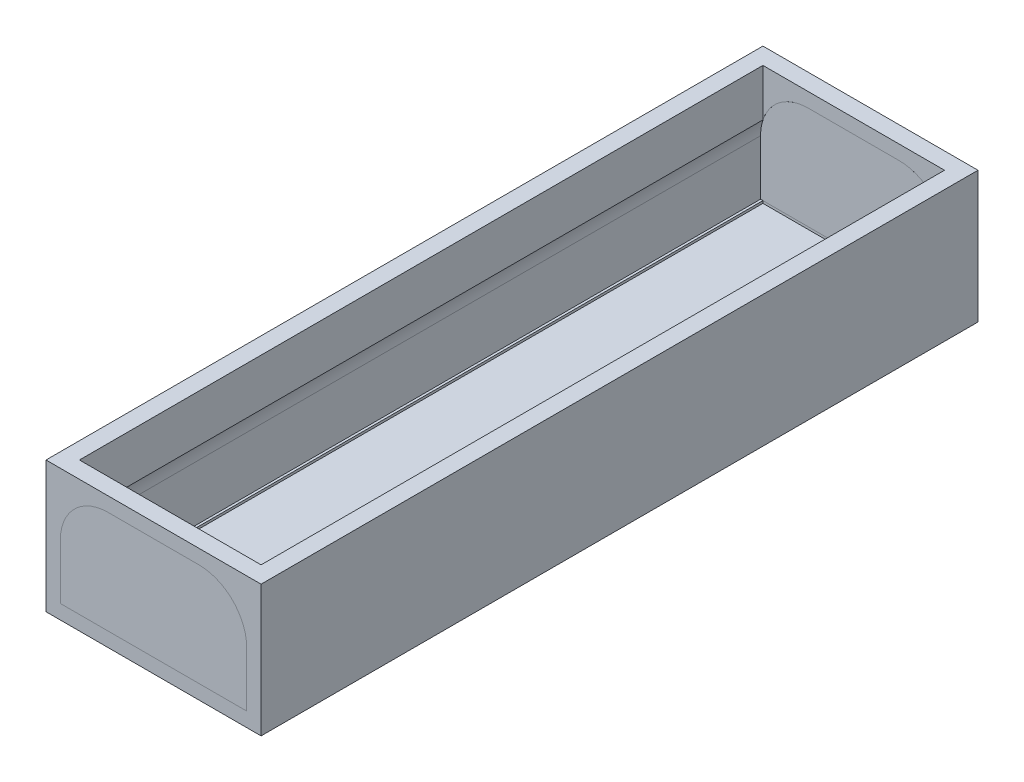
ISO-10303-21;
HEADER;
FILE_DESCRIPTION(('STEP AP214'),'2;1');
FILE_NAME('part.step','',(''),(''),'','','');
FILE_SCHEMA(('AUTOMOTIVE_DESIGN { 1 0 10303 214 1 1 1 1 }'));
ENDSEC;
DATA;
#1=APPLICATION_CONTEXT('core data for automotive mechanical design processes');
#2=APPLICATION_PROTOCOL_DEFINITION('international standard','automotive_design',2000,#1);
#3=PRODUCT_CONTEXT('',#1,'mechanical');
#4=PRODUCT('Part','Part','',(#3));
#5=PRODUCT_RELATED_PRODUCT_CATEGORY('part','',(#4));
#6=PRODUCT_DEFINITION_FORMATION('','',#4);
#7=PRODUCT_DEFINITION_CONTEXT('part definition',#1,'design');
#8=PRODUCT_DEFINITION('design','',#6,#7);
#9=PRODUCT_DEFINITION_SHAPE('','',#8);
#10=(LENGTH_UNIT() NAMED_UNIT(*) SI_UNIT(.MILLI.,.METRE.));
#11=(NAMED_UNIT(*) PLANE_ANGLE_UNIT() SI_UNIT($,.RADIAN.));
#12=(NAMED_UNIT(*) SI_UNIT($,.STERADIAN.) SOLID_ANGLE_UNIT());
#13=UNCERTAINTY_MEASURE_WITH_UNIT(LENGTH_MEASURE(1.E-05),#10,'distance_accuracy_value','');
#14=(GEOMETRIC_REPRESENTATION_CONTEXT(3) GLOBAL_UNCERTAINTY_ASSIGNED_CONTEXT((#13)) GLOBAL_UNIT_ASSIGNED_CONTEXT((#10,
#11,#12)) REPRESENTATION_CONTEXT('',''));
#15=CARTESIAN_POINT('',(0.,0.,0.));
#16=DIRECTION('',(0.,0.,1.));
#17=DIRECTION('',(1.,0.,0.));
#18=AXIS2_PLACEMENT_3D('',#15,#16,#17);
#19=CARTESIAN_POINT('',(-19.,1.49999999999999,7.00000000000006));
#20=DIRECTION('',(0.,0.,-1.));
#21=DIRECTION('',(1.,0.,0.));
#22=AXIS2_PLACEMENT_3D('',#19,#20,#21);
#23=CYLINDRICAL_SURFACE('',#22,20.);
#24=CARTESIAN_POINT('',(-19.,1.49999999999999,2.00000000000006));
#25=DIRECTION('',(0.,0.,1.));
#26=DIRECTION('',(1.,0.,0.));
#27=AXIS2_PLACEMENT_3D('',#24,#25,#26);
#28=CIRCLE('',#27,20.);
#29=CARTESIAN_POINT('',(-18.9999999999999,21.5,2.00000000000006));
#30=VERTEX_POINT('',#29);
#31=CARTESIAN_POINT('',(-39.,1.49999999999985,2.00000000000006));
#32=VERTEX_POINT('',#31);
#33=EDGE_CURVE('E140',#30,#32,#28,.T.);
#34=ORIENTED_EDGE('',*,*,#33,.T.);
#35=DIRECTION('',(0.,0.,-1.));
#36=VECTOR('',#35,1.);
#37=CARTESIAN_POINT('',(-39.,1.49999999999985,7.00000000000006));
#38=LINE('',#37,#36);
#39=CARTESIAN_POINT('',(-39.,1.49999999999985,7.00000000000006));
#40=VERTEX_POINT('',#39);
#41=EDGE_CURVE('E59',#40,#32,#38,.T.);
#42=ORIENTED_EDGE('',*,*,#41,.F.);
#43=CARTESIAN_POINT('',(-19.,1.49999999999999,7.00000000000006));
#44=DIRECTION('',(0.,0.,1.));
#45=DIRECTION('',(1.,0.,0.));
#46=AXIS2_PLACEMENT_3D('',#43,#44,#45);
#47=CIRCLE('',#46,20.);
#48=CARTESIAN_POINT('',(-18.9999999999999,21.5,7.00000000000006));
#49=VERTEX_POINT('',#48);
#50=EDGE_CURVE('E149',#49,#40,#47,.T.);
#51=ORIENTED_EDGE('',*,*,#50,.F.);
#52=DIRECTION('',(0.,0.,-1.));
#53=VECTOR('',#52,1.);
#54=CARTESIAN_POINT('',(-18.9999999999999,21.5,7.00000000000006));
#55=LINE('',#54,#53);
#56=EDGE_CURVE('E12',#49,#30,#55,.T.);
#57=ORIENTED_EDGE('',*,*,#56,.T.);
#58=EDGE_LOOP('',(#34,#42,#51,#57));
#59=FACE_BOUND('',#58,.T.);
#60=ADVANCED_FACE('F56',(#59),#23,.T.);
#61=CARTESIAN_POINT('',(18.9999999999999,21.5,7.00000000000006));
#62=DIRECTION('',(0.,1.,0.));
#63=DIRECTION('',(-1.,0.,0.));
#64=AXIS2_PLACEMENT_3D('',#61,#62,#63);
#65=PLANE('',#64);
#66=DIRECTION('',(-1.,0.,0.));
#67=VECTOR('',#66,1.);
#68=CARTESIAN_POINT('',(18.9999999999999,21.5,2.00000000000006));
#69=LINE('',#68,#67);
#70=CARTESIAN_POINT('',(18.9999999999999,21.5,2.00000000000006));
#71=VERTEX_POINT('',#70);
#72=EDGE_CURVE('E103',#71,#30,#69,.T.);
#73=ORIENTED_EDGE('',*,*,#72,.T.);
#74=ORIENTED_EDGE('',*,*,#56,.F.);
#75=DIRECTION('',(-1.,0.,0.));
#76=VECTOR('',#75,1.);
#77=CARTESIAN_POINT('',(18.9999999999999,21.5,7.00000000000006));
#78=LINE('',#77,#76);
#79=CARTESIAN_POINT('',(18.9999999999999,21.5,7.00000000000006));
#80=VERTEX_POINT('',#79);
#81=EDGE_CURVE('E74',#80,#49,#78,.T.);
#82=ORIENTED_EDGE('',*,*,#81,.F.);
#83=DIRECTION('',(0.,0.,-1.));
#84=VECTOR('',#83,1.);
#85=CARTESIAN_POINT('',(18.9999999999999,21.5,7.00000000000006));
#86=LINE('',#85,#84);
#87=EDGE_CURVE('E65',#80,#71,#86,.T.);
#88=ORIENTED_EDGE('',*,*,#87,.T.);
#89=EDGE_LOOP('',(#73,#74,#82,#88));
#90=FACE_BOUND('',#89,.T.);
#91=ADVANCED_FACE('F174',(#90),#65,.T.);
#92=CARTESIAN_POINT('',(19.,1.5,7.00000000000006));
#93=DIRECTION('',(0.,0.,-1.));
#94=DIRECTION('',(1.,0.,0.));
#95=AXIS2_PLACEMENT_3D('',#92,#93,#94);
#96=CYLINDRICAL_SURFACE('',#95,20.);
#97=CARTESIAN_POINT('',(19.,1.5,2.00000000000006));
#98=DIRECTION('',(0.,0.,1.));
#99=DIRECTION('',(1.,0.,0.));
#100=AXIS2_PLACEMENT_3D('',#97,#98,#99);
#101=CIRCLE('',#100,20.);
#102=CARTESIAN_POINT('',(39.,1.49999999999986,2.00000000000006));
#103=VERTEX_POINT('',#102);
#104=EDGE_CURVE('E97',#103,#71,#101,.T.);
#105=ORIENTED_EDGE('',*,*,#104,.T.);
#106=ORIENTED_EDGE('',*,*,#87,.F.);
#107=CARTESIAN_POINT('',(19.,1.5,7.00000000000006));
#108=DIRECTION('',(0.,0.,1.));
#109=DIRECTION('',(1.,0.,0.));
#110=AXIS2_PLACEMENT_3D('',#107,#108,#109);
#111=CIRCLE('',#110,20.);
#112=CARTESIAN_POINT('',(39.,1.49999999999986,7.00000000000006));
#113=VERTEX_POINT('',#112);
#114=EDGE_CURVE('E122',#113,#80,#111,.T.);
#115=ORIENTED_EDGE('',*,*,#114,.F.);
#116=DIRECTION('',(0.,0.,-1.));
#117=VECTOR('',#116,1.);
#118=CARTESIAN_POINT('',(39.,1.49999999999986,7.00000000000006));
#119=LINE('',#118,#117);
#120=EDGE_CURVE('E129',#113,#103,#119,.T.);
#121=ORIENTED_EDGE('',*,*,#120,.T.);
#122=EDGE_LOOP('',(#105,#106,#115,#121));
#123=FACE_BOUND('',#122,.T.);
#124=ADVANCED_FACE('F135',(#123),#96,.T.);
#125=CARTESIAN_POINT('',(39.,-21.5,7.00000000000006));
#126=DIRECTION('',(1.,0.,0.));
#127=DIRECTION('',(0.,1.,0.));
#128=AXIS2_PLACEMENT_3D('',#125,#126,#127);
#129=PLANE('',#128);
#130=DIRECTION('',(0.,1.,0.));
#131=VECTOR('',#130,1.);
#132=CARTESIAN_POINT('',(39.,-21.5,2.00000000000006));
#133=LINE('',#132,#131);
#134=CARTESIAN_POINT('',(39.,-21.5,2.00000000000006));
#135=VERTEX_POINT('',#134);
#136=EDGE_CURVE('E132',#135,#103,#133,.T.);
#137=ORIENTED_EDGE('',*,*,#136,.T.);
#138=ORIENTED_EDGE('',*,*,#120,.F.);
#139=DIRECTION('',(0.,1.,0.));
#140=VECTOR('',#139,1.);
#141=CARTESIAN_POINT('',(39.,-21.5,7.00000000000006));
#142=LINE('',#141,#140);
#143=CARTESIAN_POINT('',(39.,-21.5,7.00000000000006));
#144=VERTEX_POINT('',#143);
#145=EDGE_CURVE('E118',#144,#113,#142,.T.);
#146=ORIENTED_EDGE('',*,*,#145,.F.);
#147=DIRECTION('',(0.,0.,-1.));
#148=VECTOR('',#147,1.);
#149=CARTESIAN_POINT('',(39.,-21.5,7.00000000000006));
#150=LINE('',#149,#148);
#151=EDGE_CURVE('E133',#144,#135,#150,.T.);
#152=ORIENTED_EDGE('',*,*,#151,.T.);
#153=EDGE_LOOP('',(#137,#138,#146,#152));
#154=FACE_BOUND('',#153,.T.);
#155=ADVANCED_FACE('F130',(#154),#129,.T.);
#156=CARTESIAN_POINT('',(-39.,-21.5,7.00000000000006));
#157=DIRECTION('',(0.,-1.,0.));
#158=DIRECTION('',(1.,0.,0.));
#159=AXIS2_PLACEMENT_3D('',#156,#157,#158);
#160=PLANE('',#159);
#161=DIRECTION('',(1.,0.,0.));
#162=VECTOR('',#161,1.);
#163=CARTESIAN_POINT('',(-39.,-21.5,2.00000000000006));
#164=LINE('',#163,#162);
#165=CARTESIAN_POINT('',(-39.,-21.5,2.00000000000006));
#166=VERTEX_POINT('',#165);
#167=EDGE_CURVE('E145',#166,#135,#164,.T.);
#168=ORIENTED_EDGE('',*,*,#167,.T.);
#169=ORIENTED_EDGE('',*,*,#151,.F.);
#170=DIRECTION('',(1.,0.,0.));
#171=VECTOR('',#170,1.);
#172=CARTESIAN_POINT('',(-39.,-21.5,7.00000000000006));
#173=LINE('',#172,#171);
#174=CARTESIAN_POINT('',(-39.,-21.5,7.00000000000006));
#175=VERTEX_POINT('',#174);
#176=EDGE_CURVE('E124',#175,#144,#173,.T.);
#177=ORIENTED_EDGE('',*,*,#176,.F.);
#178=DIRECTION('',(0.,0.,-1.));
#179=VECTOR('',#178,1.);
#180=CARTESIAN_POINT('',(-39.,-21.5,7.00000000000006));
#181=LINE('',#180,#179);
#182=EDGE_CURVE('E152',#175,#166,#181,.T.);
#183=ORIENTED_EDGE('',*,*,#182,.T.);
#184=EDGE_LOOP('',(#168,#169,#177,#183));
#185=FACE_BOUND('',#184,.T.);
#186=ADVANCED_FACE('F163',(#185),#160,.T.);
#187=CARTESIAN_POINT('',(-39.,1.49999999999985,7.00000000000006));
#188=DIRECTION('',(-1.,0.,0.));
#189=DIRECTION('',(0.,0.,-1.));
#190=AXIS2_PLACEMENT_3D('',#187,#188,#189);
#191=PLANE('',#190);
#192=DIRECTION('',(0.,-1.,0.));
#193=VECTOR('',#192,1.);
#194=CARTESIAN_POINT('',(-39.,1.49999999999985,2.00000000000006));
#195=LINE('',#194,#193);
#196=EDGE_CURVE('E143',#32,#166,#195,.T.);
#197=ORIENTED_EDGE('',*,*,#196,.T.);
#198=ORIENTED_EDGE('',*,*,#182,.F.);
#199=DIRECTION('',(0.,-1.,0.));
#200=VECTOR('',#199,1.);
#201=CARTESIAN_POINT('',(-39.,1.49999999999985,7.00000000000006));
#202=LINE('',#201,#200);
#203=EDGE_CURVE('E111',#40,#175,#202,.T.);
#204=ORIENTED_EDGE('',*,*,#203,.F.);
#205=ORIENTED_EDGE('',*,*,#41,.T.);
#206=EDGE_LOOP('',(#197,#198,#204,#205));
#207=FACE_BOUND('',#206,.T.);
#208=ADVANCED_FACE('F157',(#207),#191,.T.);
#209=CARTESIAN_POINT('',(-19.,1.49999999999999,7.00000000000006));
#210=DIRECTION('',(0.,0.,-1.));
#211=DIRECTION('',(1.,0.,0.));
#212=AXIS2_PLACEMENT_3D('',#209,#210,#211);
#213=PLANE('',#212);
#214=ORIENTED_EDGE('',*,*,#50,.T.);
#215=ORIENTED_EDGE('',*,*,#203,.T.);
#216=ORIENTED_EDGE('',*,*,#176,.T.);
#217=ORIENTED_EDGE('',*,*,#145,.T.);
#218=ORIENTED_EDGE('',*,*,#114,.T.);
#219=ORIENTED_EDGE('',*,*,#81,.T.);
#220=EDGE_LOOP('',(#214,#215,#216,#217,#218,#219));
#221=FACE_BOUND('',#220,.T.);
#222=ADVANCED_FACE('F120',(#221),#213,.F.);
#223=CARTESIAN_POINT('',(-19.,1.49999999999999,2.00000000000006));
#224=DIRECTION('',(0.,0.,-1.));
#225=DIRECTION('',(1.,0.,0.));
#226=AXIS2_PLACEMENT_3D('',#223,#224,#225);
#227=PLANE('',#226);
#228=ORIENTED_EDGE('',*,*,#33,.F.);
#229=ORIENTED_EDGE('',*,*,#72,.F.);
#230=ORIENTED_EDGE('',*,*,#104,.F.);
#231=ORIENTED_EDGE('',*,*,#136,.F.);
#232=ORIENTED_EDGE('',*,*,#167,.F.);
#233=ORIENTED_EDGE('',*,*,#196,.F.);
#234=EDGE_LOOP('',(#228,#229,#230,#231,#232,#233));
#235=FACE_BOUND('',#234,.T.);
#236=ADVANCED_FACE('F162',(#235),#227,.T.);
#237=CLOSED_SHELL('',(#60,#91,#124,#155,#186,#208,#222,#236));
#238=MANIFOLD_SOLID_BREP('B2',#237);
#239=CARTESIAN_POINT('',(-19.,1.49999999999999,295.));
#240=DIRECTION('',(0.,0.,1.));
#241=DIRECTION('',(1.,0.,0.));
#242=AXIS2_PLACEMENT_3D('',#239,#240,#241);
#243=CYLINDRICAL_SURFACE('',#242,20.);
#244=CARTESIAN_POINT('',(-19.,1.49999999999999,300.));
#245=DIRECTION('',(0.,0.,1.));
#246=DIRECTION('',(1.,0.,0.));
#247=AXIS2_PLACEMENT_3D('',#244,#245,#246);
#248=CIRCLE('',#247,20.);
#249=CARTESIAN_POINT('',(-18.9999999999999,21.5,300.));
#250=VERTEX_POINT('',#249);
#251=CARTESIAN_POINT('',(-39.,1.49999999999985,300.));
#252=VERTEX_POINT('',#251);
#253=EDGE_CURVE('E373',#250,#252,#248,.T.);
#254=ORIENTED_EDGE('',*,*,#253,.F.);
#255=DIRECTION('',(0.,0.,1.));
#256=VECTOR('',#255,1.);
#257=CARTESIAN_POINT('',(-18.9999999999999,21.5,295.));
#258=LINE('',#257,#256);
#259=CARTESIAN_POINT('',(-18.9999999999999,21.5,295.));
#260=VERTEX_POINT('',#259);
#261=EDGE_CURVE('E54',#260,#250,#258,.T.);
#262=ORIENTED_EDGE('',*,*,#261,.F.);
#263=CARTESIAN_POINT('',(-19.,1.49999999999999,295.));
#264=DIRECTION('',(0.,0.,1.));
#265=DIRECTION('',(1.,0.,0.));
#266=AXIS2_PLACEMENT_3D('',#263,#264,#265);
#267=CIRCLE('',#266,20.);
#268=CARTESIAN_POINT('',(-39.,1.49999999999985,295.));
#269=VERTEX_POINT('',#268);
#270=EDGE_CURVE('E387',#260,#269,#267,.T.);
#271=ORIENTED_EDGE('',*,*,#270,.T.);
#272=DIRECTION('',(0.,0.,1.));
#273=VECTOR('',#272,1.);
#274=CARTESIAN_POINT('',(-39.,1.49999999999985,295.));
#275=LINE('',#274,#273);
#276=EDGE_CURVE('E291',#269,#252,#275,.T.);
#277=ORIENTED_EDGE('',*,*,#276,.T.);
#278=EDGE_LOOP('',(#254,#262,#271,#277));
#279=FACE_BOUND('',#278,.T.);
#280=ADVANCED_FACE('F288',(#279),#243,.T.);
#281=CARTESIAN_POINT('',(18.9999999999999,21.5,295.));
#282=DIRECTION('',(0.,1.,0.));
#283=DIRECTION('',(-1.,0.,0.));
#284=AXIS2_PLACEMENT_3D('',#281,#282,#283);
#285=PLANE('',#284);
#286=DIRECTION('',(-1.,0.,0.));
#287=VECTOR('',#286,1.);
#288=CARTESIAN_POINT('',(18.9999999999999,21.5,300.));
#289=LINE('',#288,#287);
#290=CARTESIAN_POINT('',(18.9999999999999,21.5,300.));
#291=VERTEX_POINT('',#290);
#292=EDGE_CURVE('E385',#291,#250,#289,.T.);
#293=ORIENTED_EDGE('',*,*,#292,.F.);
#294=DIRECTION('',(0.,0.,1.));
#295=VECTOR('',#294,1.);
#296=CARTESIAN_POINT('',(18.9999999999999,21.5,295.));
#297=LINE('',#296,#295);
#298=CARTESIAN_POINT('',(18.9999999999999,21.5,295.));
#299=VERTEX_POINT('',#298);
#300=EDGE_CURVE('E297',#299,#291,#297,.T.);
#301=ORIENTED_EDGE('',*,*,#300,.F.);
#302=DIRECTION('',(-1.,0.,0.));
#303=VECTOR('',#302,1.);
#304=CARTESIAN_POINT('',(18.9999999999999,21.5,295.));
#305=LINE('',#304,#303);
#306=EDGE_CURVE('E363',#299,#260,#305,.T.);
#307=ORIENTED_EDGE('',*,*,#306,.T.);
#308=ORIENTED_EDGE('',*,*,#261,.T.);
#309=EDGE_LOOP('',(#293,#301,#307,#308));
#310=FACE_BOUND('',#309,.T.);
#311=ADVANCED_FACE('F395',(#310),#285,.T.);
#312=CARTESIAN_POINT('',(19.,1.5,295.));
#313=DIRECTION('',(0.,0.,1.));
#314=DIRECTION('',(1.,0.,0.));
#315=AXIS2_PLACEMENT_3D('',#312,#313,#314);
#316=CYLINDRICAL_SURFACE('',#315,20.);
#317=CARTESIAN_POINT('',(19.,1.5,300.));
#318=DIRECTION('',(0.,0.,1.));
#319=DIRECTION('',(1.,0.,0.));
#320=AXIS2_PLACEMENT_3D('',#317,#318,#319);
#321=CIRCLE('',#320,20.);
#322=CARTESIAN_POINT('',(39.,1.49999999999986,300.));
#323=VERTEX_POINT('',#322);
#324=EDGE_CURVE('E350',#323,#291,#321,.T.);
#325=ORIENTED_EDGE('',*,*,#324,.F.);
#326=DIRECTION('',(0.,0.,1.));
#327=VECTOR('',#326,1.);
#328=CARTESIAN_POINT('',(39.,1.49999999999986,295.));
#329=LINE('',#328,#327);
#330=CARTESIAN_POINT('',(39.,1.49999999999986,295.));
#331=VERTEX_POINT('',#330);
#332=EDGE_CURVE('E345',#331,#323,#329,.T.);
#333=ORIENTED_EDGE('',*,*,#332,.F.);
#334=CARTESIAN_POINT('',(19.,1.5,295.));
#335=DIRECTION('',(0.,0.,1.));
#336=DIRECTION('',(1.,0.,0.));
#337=AXIS2_PLACEMENT_3D('',#334,#335,#336);
#338=CIRCLE('',#337,20.);
#339=EDGE_CURVE('E348',#331,#299,#338,.T.);
#340=ORIENTED_EDGE('',*,*,#339,.T.);
#341=ORIENTED_EDGE('',*,*,#300,.T.);
#342=EDGE_LOOP('',(#325,#333,#340,#341));
#343=FACE_BOUND('',#342,.T.);
#344=ADVANCED_FACE('F347',(#343),#316,.T.);
#345=CARTESIAN_POINT('',(39.,-21.5,295.));
#346=DIRECTION('',(1.,0.,0.));
#347=DIRECTION('',(0.,1.,0.));
#348=AXIS2_PLACEMENT_3D('',#345,#346,#347);
#349=PLANE('',#348);
#350=DIRECTION('',(0.,1.,0.));
#351=VECTOR('',#350,1.);
#352=CARTESIAN_POINT('',(39.,-21.5,300.));
#353=LINE('',#352,#351);
#354=CARTESIAN_POINT('',(39.,-21.5,300.));
#355=VERTEX_POINT('',#354);
#356=EDGE_CURVE('E382',#355,#323,#353,.T.);
#357=ORIENTED_EDGE('',*,*,#356,.F.);
#358=DIRECTION('',(0.,0.,1.));
#359=VECTOR('',#358,1.);
#360=CARTESIAN_POINT('',(39.,-21.5,295.));
#361=LINE('',#360,#359);
#362=CARTESIAN_POINT('',(39.,-21.5,295.));
#363=VERTEX_POINT('',#362);
#364=EDGE_CURVE('E355',#363,#355,#361,.T.);
#365=ORIENTED_EDGE('',*,*,#364,.F.);
#366=DIRECTION('',(0.,1.,0.));
#367=VECTOR('',#366,1.);
#368=CARTESIAN_POINT('',(39.,-21.5,295.));
#369=LINE('',#368,#367);
#370=EDGE_CURVE('E361',#363,#331,#369,.T.);
#371=ORIENTED_EDGE('',*,*,#370,.T.);
#372=ORIENTED_EDGE('',*,*,#332,.T.);
#373=EDGE_LOOP('',(#357,#365,#371,#372));
#374=FACE_BOUND('',#373,.T.);
#375=ADVANCED_FACE('F365',(#374),#349,.T.);
#376=CARTESIAN_POINT('',(-39.,-21.5,295.));
#377=DIRECTION('',(0.,-1.,0.));
#378=DIRECTION('',(1.,0.,0.));
#379=AXIS2_PLACEMENT_3D('',#376,#377,#378);
#380=PLANE('',#379);
#381=DIRECTION('',(1.,0.,0.));
#382=VECTOR('',#381,1.);
#383=CARTESIAN_POINT('',(-39.,-21.5,300.));
#384=LINE('',#383,#382);
#385=CARTESIAN_POINT('',(-39.,-21.5,300.));
#386=VERTEX_POINT('',#385);
#387=EDGE_CURVE('E379',#386,#355,#384,.T.);
#388=ORIENTED_EDGE('',*,*,#387,.F.);
#389=DIRECTION('',(0.,0.,1.));
#390=VECTOR('',#389,1.);
#391=CARTESIAN_POINT('',(-39.,-21.5,295.));
#392=LINE('',#391,#390);
#393=CARTESIAN_POINT('',(-39.,-21.5,295.));
#394=VERTEX_POINT('',#393);
#395=EDGE_CURVE('E390',#394,#386,#392,.T.);
#396=ORIENTED_EDGE('',*,*,#395,.F.);
#397=DIRECTION('',(1.,0.,0.));
#398=VECTOR('',#397,1.);
#399=CARTESIAN_POINT('',(-39.,-21.5,295.));
#400=LINE('',#399,#398);
#401=EDGE_CURVE('E366',#394,#363,#400,.T.);
#402=ORIENTED_EDGE('',*,*,#401,.T.);
#403=ORIENTED_EDGE('',*,*,#364,.T.);
#404=EDGE_LOOP('',(#388,#396,#402,#403));
#405=FACE_BOUND('',#404,.T.);
#406=ADVANCED_FACE('F408',(#405),#380,.T.);
#407=CARTESIAN_POINT('',(-39.,1.49999999999985,295.));
#408=DIRECTION('',(-1.,0.,0.));
#409=DIRECTION('',(0.,0.,1.));
#410=AXIS2_PLACEMENT_3D('',#407,#408,#409);
#411=PLANE('',#410);
#412=DIRECTION('',(0.,-1.,0.));
#413=VECTOR('',#412,1.);
#414=CARTESIAN_POINT('',(-39.,1.49999999999985,300.));
#415=LINE('',#414,#413);
#416=EDGE_CURVE('E376',#252,#386,#415,.T.);
#417=ORIENTED_EDGE('',*,*,#416,.F.);
#418=ORIENTED_EDGE('',*,*,#276,.F.);
#419=DIRECTION('',(0.,-1.,0.));
#420=VECTOR('',#419,1.);
#421=CARTESIAN_POINT('',(-39.,1.49999999999985,295.));
#422=LINE('',#421,#420);
#423=EDGE_CURVE('E368',#269,#394,#422,.T.);
#424=ORIENTED_EDGE('',*,*,#423,.T.);
#425=ORIENTED_EDGE('',*,*,#395,.T.);
#426=EDGE_LOOP('',(#417,#418,#424,#425));
#427=FACE_BOUND('',#426,.T.);
#428=ADVANCED_FACE('F392',(#427),#411,.T.);
#429=CARTESIAN_POINT('',(-19.,1.49999999999999,295.));
#430=DIRECTION('',(0.,0.,1.));
#431=DIRECTION('',(1.,0.,0.));
#432=AXIS2_PLACEMENT_3D('',#429,#430,#431);
#433=PLANE('',#432);
#434=ORIENTED_EDGE('',*,*,#270,.F.);
#435=ORIENTED_EDGE('',*,*,#306,.F.);
#436=ORIENTED_EDGE('',*,*,#339,.F.);
#437=ORIENTED_EDGE('',*,*,#370,.F.);
#438=ORIENTED_EDGE('',*,*,#401,.F.);
#439=ORIENTED_EDGE('',*,*,#423,.F.);
#440=EDGE_LOOP('',(#434,#435,#436,#437,#438,#439));
#441=FACE_BOUND('',#440,.T.);
#442=ADVANCED_FACE('F359',(#441),#433,.F.);
#443=CARTESIAN_POINT('',(-19.,1.49999999999999,300.));
#444=DIRECTION('',(0.,0.,1.));
#445=DIRECTION('',(1.,0.,0.));
#446=AXIS2_PLACEMENT_3D('',#443,#444,#445);
#447=PLANE('',#446);
#448=ORIENTED_EDGE('',*,*,#253,.T.);
#449=ORIENTED_EDGE('',*,*,#416,.T.);
#450=ORIENTED_EDGE('',*,*,#387,.T.);
#451=ORIENTED_EDGE('',*,*,#356,.T.);
#452=ORIENTED_EDGE('',*,*,#324,.T.);
#453=ORIENTED_EDGE('',*,*,#292,.T.);
#454=EDGE_LOOP('',(#448,#449,#450,#451,#452,#453));
#455=FACE_BOUND('',#454,.T.);
#456=ADVANCED_FACE('F394',(#455),#447,.T.);
#457=CLOSED_SHELL('',(#280,#311,#344,#375,#406,#428,#442,#456));
#458=MANIFOLD_SOLID_BREP('B6',#457);
#459=CARTESIAN_POINT('',(38.,-22.4999999999999,293.));
#460=DIRECTION('',(1.,0.,0.));
#461=DIRECTION('',(0.,1.,0.));
#462=AXIS2_PLACEMENT_3D('',#459,#460,#461);
#463=PLANE('',#462);
#464=DIRECTION('',(0.,1.,0.));
#465=VECTOR('',#464,1.);
#466=CARTESIAN_POINT('',(38.,-22.4999999999999,7.));
#467=LINE('',#466,#465);
#468=CARTESIAN_POINT('',(38.,7.74499799839839,7.00000000000001));
#469=VERTEX_POINT('',#468);
#470=CARTESIAN_POINT('',(38.,27.5,7.00000000000001));
#471=VERTEX_POINT('',#470);
#472=EDGE_CURVE('E725',#469,#471,#467,.T.);
#473=ORIENTED_EDGE('',*,*,#472,.F.);
#474=DIRECTION('',(0.,0.,1.));
#475=VECTOR('',#474,1.);
#476=CARTESIAN_POINT('',(38.,7.7449979983984,-175.));
#477=LINE('',#476,#475);
#478=CARTESIAN_POINT('',(38.,7.7449979983984,293.));
#479=VERTEX_POINT('',#478);
#480=EDGE_CURVE('E702',#469,#479,#477,.T.);
#481=ORIENTED_EDGE('',*,*,#480,.T.);
#482=DIRECTION('',(0.,1.,0.));
#483=VECTOR('',#482,1.);
#484=CARTESIAN_POINT('',(38.,-22.4999999999999,293.));
#485=LINE('',#484,#483);
#486=CARTESIAN_POINT('',(38.,27.5,293.));
#487=VERTEX_POINT('',#486);
#488=EDGE_CURVE('E740',#479,#487,#485,.T.);
#489=ORIENTED_EDGE('',*,*,#488,.T.);
#490=DIRECTION('',(0.,0.,-1.));
#491=VECTOR('',#490,1.);
#492=CARTESIAN_POINT('',(38.,27.5,293.));
#493=LINE('',#492,#491);
#494=EDGE_CURVE('E711',#487,#471,#493,.T.);
#495=ORIENTED_EDGE('',*,*,#494,.T.);
#496=EDGE_LOOP('',(#473,#481,#489,#495));
#497=FACE_BOUND('',#496,.T.);
#498=ADVANCED_FACE('F497',(#497),#463,.F.);
#499=CARTESIAN_POINT('',(-45.,-27.5,300.));
#500=DIRECTION('',(1.,0.,0.));
#501=DIRECTION('',(0.,0.,-1.));
#502=AXIS2_PLACEMENT_3D('',#499,#500,#501);
#503=PLANE('',#502);
#504=DIRECTION('',(0.,-1.,0.));
#505=VECTOR('',#504,1.);
#506=CARTESIAN_POINT('',(-45.,-27.5,0.));
#507=LINE('',#506,#505);
#508=CARTESIAN_POINT('',(-45.,27.5,0.));
#509=VERTEX_POINT('',#508);
#510=CARTESIAN_POINT('',(-45.,-27.5,0.));
#511=VERTEX_POINT('',#510);
#512=EDGE_CURVE('E739',#509,#511,#507,.T.);
#513=ORIENTED_EDGE('',*,*,#512,.T.);
#514=DIRECTION('',(0.,0.,-1.));
#515=VECTOR('',#514,1.);
#516=CARTESIAN_POINT('',(-45.,-27.5,300.));
#517=LINE('',#516,#515);
#518=CARTESIAN_POINT('',(-45.,-27.5,300.));
#519=VERTEX_POINT('',#518);
#520=EDGE_CURVE('E778',#519,#511,#517,.T.);
#521=ORIENTED_EDGE('',*,*,#520,.F.);
#522=DIRECTION('',(0.,-1.,0.));
#523=VECTOR('',#522,1.);
#524=CARTESIAN_POINT('',(-45.,-27.5,300.));
#525=LINE('',#524,#523);
#526=CARTESIAN_POINT('',(-45.,27.5,300.));
#527=VERTEX_POINT('',#526);
#528=EDGE_CURVE('E752',#527,#519,#525,.T.);
#529=ORIENTED_EDGE('',*,*,#528,.F.);
#530=DIRECTION('',(0.,0.,-1.));
#531=VECTOR('',#530,1.);
#532=CARTESIAN_POINT('',(-45.,27.5,300.));
#533=LINE('',#532,#531);
#534=EDGE_CURVE('E762',#527,#509,#533,.T.);
#535=ORIENTED_EDGE('',*,*,#534,.T.);
#536=EDGE_LOOP('',(#513,#521,#529,#535));
#537=FACE_BOUND('',#536,.T.);
#538=ADVANCED_FACE('F499',(#537),#503,.F.);
#539=CARTESIAN_POINT('',(45.,-27.5,300.));
#540=DIRECTION('',(0.,1.,0.));
#541=DIRECTION('',(-1.,0.,0.));
#542=AXIS2_PLACEMENT_3D('',#539,#540,#541);
#543=PLANE('',#542);
#544=DIRECTION('',(1.,0.,0.));
#545=VECTOR('',#544,1.);
#546=CARTESIAN_POINT('',(45.,-27.5,0.));
#547=LINE('',#546,#545);
#548=CARTESIAN_POINT('',(45.,-27.5,0.));
#549=VERTEX_POINT('',#548);
#550=EDGE_CURVE('E765',#511,#549,#547,.T.);
#551=ORIENTED_EDGE('',*,*,#550,.T.);
#552=DIRECTION('',(0.,0.,-1.));
#553=VECTOR('',#552,1.);
#554=CARTESIAN_POINT('',(45.,-27.5,300.));
#555=LINE('',#554,#553);
#556=CARTESIAN_POINT('',(45.,-27.5,300.));
#557=VERTEX_POINT('',#556);
#558=EDGE_CURVE('E775',#557,#549,#555,.T.);
#559=ORIENTED_EDGE('',*,*,#558,.F.);
#560=DIRECTION('',(1.,0.,0.));
#561=VECTOR('',#560,1.);
#562=CARTESIAN_POINT('',(45.,-27.5,300.));
#563=LINE('',#562,#561);
#564=EDGE_CURVE('E755',#519,#557,#563,.T.);
#565=ORIENTED_EDGE('',*,*,#564,.F.);
#566=ORIENTED_EDGE('',*,*,#520,.T.);
#567=EDGE_LOOP('',(#551,#559,#565,#566));
#568=FACE_BOUND('',#567,.T.);
#569=ADVANCED_FACE('F836',(#568),#543,.F.);
#570=CARTESIAN_POINT('',(45.,-27.5,300.));
#571=DIRECTION('',(-1.,0.,0.));
#572=DIRECTION('',(0.,-1.,0.));
#573=AXIS2_PLACEMENT_3D('',#570,#571,#572);
#574=PLANE('',#573);
#575=DIRECTION('',(0.,1.,0.));
#576=VECTOR('',#575,1.);
#577=CARTESIAN_POINT('',(45.,-27.5,0.));
#578=LINE('',#577,#576);
#579=CARTESIAN_POINT('',(45.,27.5,0.));
#580=VERTEX_POINT('',#579);
#581=EDGE_CURVE('E767',#549,#580,#578,.T.);
#582=ORIENTED_EDGE('',*,*,#581,.T.);
#583=DIRECTION('',(0.,0.,-1.));
#584=VECTOR('',#583,1.);
#585=CARTESIAN_POINT('',(45.,27.5,300.));
#586=LINE('',#585,#584);
#587=CARTESIAN_POINT('',(45.,27.5,300.));
#588=VERTEX_POINT('',#587);
#589=EDGE_CURVE('E772',#588,#580,#586,.T.);
#590=ORIENTED_EDGE('',*,*,#589,.F.);
#591=DIRECTION('',(0.,1.,0.));
#592=VECTOR('',#591,1.);
#593=CARTESIAN_POINT('',(45.,-27.5,300.));
#594=LINE('',#593,#592);
#595=EDGE_CURVE('E758',#557,#588,#594,.T.);
#596=ORIENTED_EDGE('',*,*,#595,.F.);
#597=ORIENTED_EDGE('',*,*,#558,.T.);
#598=EDGE_LOOP('',(#582,#590,#596,#597));
#599=FACE_BOUND('',#598,.T.);
#600=ADVANCED_FACE('F823',(#599),#574,.F.);
#601=CARTESIAN_POINT('',(45.,27.5,300.));
#602=DIRECTION('',(0.,-1.,0.));
#603=DIRECTION('',(1.,0.,0.));
#604=AXIS2_PLACEMENT_3D('',#601,#602,#603);
#605=PLANE('',#604);
#606=DIRECTION('',(-1.,0.,0.));
#607=VECTOR('',#606,1.);
#608=CARTESIAN_POINT('',(38.,27.5,7.));
#609=LINE('',#608,#607);
#610=CARTESIAN_POINT('',(-38.,27.5,7.));
#611=VERTEX_POINT('',#610);
#612=EDGE_CURVE('E728',#471,#611,#609,.T.);
#613=ORIENTED_EDGE('',*,*,#612,.F.);
#614=ORIENTED_EDGE('',*,*,#494,.F.);
#615=DIRECTION('',(1.,0.,0.));
#616=VECTOR('',#615,1.);
#617=CARTESIAN_POINT('',(-38.,27.5,293.));
#618=LINE('',#617,#616);
#619=CARTESIAN_POINT('',(-38.,27.5,293.));
#620=VERTEX_POINT('',#619);
#621=EDGE_CURVE('E716',#620,#487,#618,.T.);
#622=ORIENTED_EDGE('',*,*,#621,.F.);
#623=DIRECTION('',(0.,0.,1.));
#624=VECTOR('',#623,1.);
#625=CARTESIAN_POINT('',(-38.,27.5,7.));
#626=LINE('',#625,#624);
#627=EDGE_CURVE('E731',#611,#620,#626,.T.);
#628=ORIENTED_EDGE('',*,*,#627,.F.);
#629=EDGE_LOOP('',(#613,#614,#622,#628));
#630=FACE_BOUND('',#629,.T.);
#631=DIRECTION('',(-1.,0.,0.));
#632=VECTOR('',#631,1.);
#633=CARTESIAN_POINT('',(45.,27.5,0.));
#634=LINE('',#633,#632);
#635=EDGE_CURVE('E756',#580,#509,#634,.T.);
#636=ORIENTED_EDGE('',*,*,#635,.T.);
#637=ORIENTED_EDGE('',*,*,#534,.F.);
#638=DIRECTION('',(-1.,0.,0.));
#639=VECTOR('',#638,1.);
#640=CARTESIAN_POINT('',(45.,27.5,300.));
#641=LINE('',#640,#639);
#642=EDGE_CURVE('E760',#588,#527,#641,.T.);
#643=ORIENTED_EDGE('',*,*,#642,.F.);
#644=ORIENTED_EDGE('',*,*,#589,.T.);
#645=EDGE_LOOP('',(#636,#637,#643,#644));
#646=FACE_BOUND('',#645,.T.);
#647=ADVANCED_FACE('F820',(#630,#646),#605,.F.);
#648=CARTESIAN_POINT('',(0.,0.,300.));
#649=DIRECTION('',(0.,0.,1.));
#650=DIRECTION('',(1.,0.,0.));
#651=AXIS2_PLACEMENT_3D('',#648,#649,#650);
#652=PLANE('',#651);
#653=CARTESIAN_POINT('',(19.,1.5,300.));
#654=DIRECTION('',(0.,0.,1.));
#655=DIRECTION('',(1.,0.,0.));
#656=AXIS2_PLACEMENT_3D('',#653,#654,#655);
#657=CIRCLE('',#656,20.);
#658=CARTESIAN_POINT('',(39.,1.49999999999986,300.));
#659=VERTEX_POINT('',#658);
#660=CARTESIAN_POINT('',(18.9999999999999,21.5,300.));
#661=VERTEX_POINT('',#660);
#662=EDGE_CURVE('E512',#659,#661,#657,.T.);
#663=ORIENTED_EDGE('',*,*,#662,.F.);
#664=DIRECTION('',(0.,1.,0.));
#665=VECTOR('',#664,1.);
#666=CARTESIAN_POINT('',(39.,-21.5,300.));
#667=LINE('',#666,#665);
#668=CARTESIAN_POINT('',(39.,-21.5,300.));
#669=VERTEX_POINT('',#668);
#670=EDGE_CURVE('E666',#669,#659,#667,.T.);
#671=ORIENTED_EDGE('',*,*,#670,.F.);
#672=DIRECTION('',(1.,0.,0.));
#673=VECTOR('',#672,1.);
#674=CARTESIAN_POINT('',(-39.,-21.5,300.));
#675=LINE('',#674,#673);
#676=CARTESIAN_POINT('',(-39.,-21.5,300.));
#677=VERTEX_POINT('',#676);
#678=EDGE_CURVE('E660',#677,#669,#675,.T.);
#679=ORIENTED_EDGE('',*,*,#678,.F.);
#680=DIRECTION('',(0.,-1.,0.));
#681=VECTOR('',#680,1.);
#682=CARTESIAN_POINT('',(-39.,1.49999999999985,300.));
#683=LINE('',#682,#681);
#684=CARTESIAN_POINT('',(-39.,1.49999999999985,300.));
#685=VERTEX_POINT('',#684);
#686=EDGE_CURVE('E658',#685,#677,#683,.T.);
#687=ORIENTED_EDGE('',*,*,#686,.F.);
#688=CARTESIAN_POINT('',(-19.,1.49999999999999,300.));
#689=DIRECTION('',(0.,0.,1.));
#690=DIRECTION('',(-1.,0.,0.));
#691=AXIS2_PLACEMENT_3D('',#688,#689,#690);
#692=CIRCLE('',#691,20.);
#693=CARTESIAN_POINT('',(-18.9999999999999,21.5,300.));
#694=VERTEX_POINT('',#693);
#695=EDGE_CURVE('E640',#694,#685,#692,.T.);
#696=ORIENTED_EDGE('',*,*,#695,.F.);
#697=DIRECTION('',(-1.,0.,0.));
#698=VECTOR('',#697,1.);
#699=CARTESIAN_POINT('',(18.9999999999999,21.5,300.));
#700=LINE('',#699,#698);
#701=EDGE_CURVE('E649',#661,#694,#700,.T.);
#702=ORIENTED_EDGE('',*,*,#701,.F.);
#703=EDGE_LOOP('',(#663,#671,#679,#687,#696,#702));
#704=FACE_BOUND('',#703,.T.);
#705=ORIENTED_EDGE('',*,*,#528,.T.);
#706=ORIENTED_EDGE('',*,*,#564,.T.);
#707=ORIENTED_EDGE('',*,*,#595,.T.);
#708=ORIENTED_EDGE('',*,*,#642,.T.);
#709=EDGE_LOOP('',(#705,#706,#707,#708));
#710=FACE_BOUND('',#709,.T.);
#711=ADVANCED_FACE('F654',(#704,#710),#652,.T.);
#712=CARTESIAN_POINT('',(0.,0.,0.));
#713=DIRECTION('',(0.,0.,1.));
#714=DIRECTION('',(1.,0.,0.));
#715=AXIS2_PLACEMENT_3D('',#712,#713,#714);
#716=PLANE('',#715);
#717=DIRECTION('',(0.,1.,0.));
#718=VECTOR('',#717,1.);
#719=CARTESIAN_POINT('',(39.,0.,0.));
#720=LINE('',#719,#718);
#721=CARTESIAN_POINT('',(39.,-21.5,0.));
#722=VERTEX_POINT('',#721);
#723=CARTESIAN_POINT('',(39.,1.49999999999986,0.));
#724=VERTEX_POINT('',#723);
#725=EDGE_CURVE('E286',#722,#724,#720,.T.);
#726=ORIENTED_EDGE('',*,*,#725,.T.);
#727=CARTESIAN_POINT('',(19.,1.5,0.));
#728=DIRECTION('',(0.,0.,1.));
#729=DIRECTION('',(1.,0.,0.));
#730=AXIS2_PLACEMENT_3D('',#727,#728,#729);
#731=CIRCLE('',#730,20.);
#732=CARTESIAN_POINT('',(18.9999999999999,21.5,0.));
#733=VERTEX_POINT('',#732);
#734=EDGE_CURVE('E708',#724,#733,#731,.T.);
#735=ORIENTED_EDGE('',*,*,#734,.T.);
#736=DIRECTION('',(-1.,0.,0.));
#737=VECTOR('',#736,1.);
#738=CARTESIAN_POINT('',(0.,21.5,0.));
#739=LINE('',#738,#737);
#740=CARTESIAN_POINT('',(-18.9999999999999,21.5,0.));
#741=VERTEX_POINT('',#740);
#742=EDGE_CURVE('E680',#733,#741,#739,.T.);
#743=ORIENTED_EDGE('',*,*,#742,.T.);
#744=CARTESIAN_POINT('',(-19.,1.49999999999999,0.));
#745=DIRECTION('',(0.,0.,1.));
#746=DIRECTION('',(1.,0.,0.));
#747=AXIS2_PLACEMENT_3D('',#744,#745,#746);
#748=CIRCLE('',#747,20.);
#749=CARTESIAN_POINT('',(-39.,1.49999999999985,0.));
#750=VERTEX_POINT('',#749);
#751=EDGE_CURVE('E687',#741,#750,#748,.T.);
#752=ORIENTED_EDGE('',*,*,#751,.T.);
#753=DIRECTION('',(0.,-1.,0.));
#754=VECTOR('',#753,1.);
#755=CARTESIAN_POINT('',(-39.,0.,0.));
#756=LINE('',#755,#754);
#757=CARTESIAN_POINT('',(-39.,-21.5,0.));
#758=VERTEX_POINT('',#757);
#759=EDGE_CURVE('E505',#750,#758,#756,.T.);
#760=ORIENTED_EDGE('',*,*,#759,.T.);
#761=DIRECTION('',(1.,0.,0.));
#762=VECTOR('',#761,1.);
#763=CARTESIAN_POINT('',(0.,-21.5,0.));
#764=LINE('',#763,#762);
#765=EDGE_CURVE('E699',#758,#722,#764,.T.);
#766=ORIENTED_EDGE('',*,*,#765,.T.);
#767=EDGE_LOOP('',(#726,#735,#743,#752,#760,#766));
#768=FACE_BOUND('',#767,.T.);
#769=ORIENTED_EDGE('',*,*,#512,.F.);
#770=ORIENTED_EDGE('',*,*,#635,.F.);
#771=ORIENTED_EDGE('',*,*,#581,.F.);
#772=ORIENTED_EDGE('',*,*,#550,.F.);
#773=EDGE_LOOP('',(#769,#770,#771,#772));
#774=FACE_BOUND('',#773,.T.);
#775=ADVANCED_FACE('F794',(#768,#774),#716,.F.);
#776=CARTESIAN_POINT('',(-38.,-22.4999999999999,293.));
#777=DIRECTION('',(0.,0.,1.));
#778=DIRECTION('',(1.,0.,0.));
#779=AXIS2_PLACEMENT_3D('',#776,#777,#778);
#780=PLANE('',#779);
#781=ORIENTED_EDGE('',*,*,#488,.F.);
#782=CARTESIAN_POINT('',(19.,1.5,293.));
#783=DIRECTION('',(0.,0.,1.));
#784=DIRECTION('',(1.,0.,0.));
#785=AXIS2_PLACEMENT_3D('',#782,#783,#784);
#786=CIRCLE('',#785,20.);
#787=CARTESIAN_POINT('',(18.9999999999999,21.5,293.));
#788=VERTEX_POINT('',#787);
#789=EDGE_CURVE('E705',#479,#788,#786,.T.);
#790=ORIENTED_EDGE('',*,*,#789,.T.);
#791=DIRECTION('',(-1.,0.,0.));
#792=VECTOR('',#791,1.);
#793=CARTESIAN_POINT('',(-38.,21.5,293.));
#794=LINE('',#793,#792);
#795=CARTESIAN_POINT('',(-18.9999999999999,21.5,293.));
#796=VERTEX_POINT('',#795);
#797=EDGE_CURVE('E671',#788,#796,#794,.T.);
#798=ORIENTED_EDGE('',*,*,#797,.T.);
#799=CARTESIAN_POINT('',(-19.,1.49999999999999,293.));
#800=DIRECTION('',(0.,0.,1.));
#801=DIRECTION('',(1.,0.,0.));
#802=AXIS2_PLACEMENT_3D('',#799,#800,#801);
#803=CIRCLE('',#802,20.);
#804=CARTESIAN_POINT('',(-38.,7.74499799839839,293.));
#805=VERTEX_POINT('',#804);
#806=EDGE_CURVE('E643',#796,#805,#803,.T.);
#807=ORIENTED_EDGE('',*,*,#806,.T.);
#808=DIRECTION('',(0.,1.,0.));
#809=VECTOR('',#808,1.);
#810=CARTESIAN_POINT('',(-38.,-22.4999999999999,293.));
#811=LINE('',#810,#809);
#812=EDGE_CURVE('E744',#805,#620,#811,.T.);
#813=ORIENTED_EDGE('',*,*,#812,.T.);
#814=ORIENTED_EDGE('',*,*,#621,.T.);
#815=EDGE_LOOP('',(#781,#790,#798,#807,#813,#814));
#816=FACE_BOUND('',#815,.T.);
#817=ADVANCED_FACE('F815',(#816),#780,.F.);
#818=CARTESIAN_POINT('',(-38.,-22.4999999999999,7.));
#819=DIRECTION('',(-1.,0.,0.));
#820=DIRECTION('',(0.,-1.,0.));
#821=AXIS2_PLACEMENT_3D('',#818,#819,#820);
#822=PLANE('',#821);
#823=ORIENTED_EDGE('',*,*,#812,.F.);
#824=DIRECTION('',(0.,0.,1.));
#825=VECTOR('',#824,1.);
#826=CARTESIAN_POINT('',(-38.,7.74499799839839,-175.));
#827=LINE('',#826,#825);
#828=CARTESIAN_POINT('',(-38.,7.7449979983984,7.00000000000001));
#829=VERTEX_POINT('',#828);
#830=EDGE_CURVE('E683',#805,#829,#827,.F.);
#831=ORIENTED_EDGE('',*,*,#830,.T.);
#832=DIRECTION('',(0.,1.,0.));
#833=VECTOR('',#832,1.);
#834=CARTESIAN_POINT('',(-38.,-22.4999999999999,7.));
#835=LINE('',#834,#833);
#836=EDGE_CURVE('E748',#829,#611,#835,.T.);
#837=ORIENTED_EDGE('',*,*,#836,.T.);
#838=ORIENTED_EDGE('',*,*,#627,.T.);
#839=EDGE_LOOP('',(#823,#831,#837,#838));
#840=FACE_BOUND('',#839,.T.);
#841=ADVANCED_FACE('F810',(#840),#822,.F.);
#842=CARTESIAN_POINT('',(38.,-22.4999999999999,7.));
#843=DIRECTION('',(0.,0.,-1.));
#844=DIRECTION('',(-1.,0.,0.));
#845=AXIS2_PLACEMENT_3D('',#842,#843,#844);
#846=PLANE('',#845);
#847=DIRECTION('',(1.,0.,0.));
#848=VECTOR('',#847,1.);
#849=CARTESIAN_POINT('',(38.,21.5,7.));
#850=LINE('',#849,#848);
#851=CARTESIAN_POINT('',(-18.9999999999999,21.5,6.99999999999995));
#852=VERTEX_POINT('',#851);
#853=CARTESIAN_POINT('',(18.9999999999999,21.5,7.));
#854=VERTEX_POINT('',#853);
#855=EDGE_CURVE('E781',#852,#854,#850,.T.);
#856=ORIENTED_EDGE('',*,*,#855,.T.);
#857=CARTESIAN_POINT('',(19.,1.5,7.00000000000001));
#858=DIRECTION('',(0.,0.,-1.));
#859=DIRECTION('',(-1.,0.,0.));
#860=AXIS2_PLACEMENT_3D('',#857,#858,#859);
#861=CIRCLE('',#860,20.);
#862=EDGE_CURVE('E787',#854,#469,#861,.T.);
#863=ORIENTED_EDGE('',*,*,#862,.T.);
#864=ORIENTED_EDGE('',*,*,#472,.T.);
#865=ORIENTED_EDGE('',*,*,#612,.T.);
#866=ORIENTED_EDGE('',*,*,#836,.F.);
#867=CARTESIAN_POINT('',(-19.,1.49999999999999,7.00000000000001));
#868=DIRECTION('',(0.,0.,-1.));
#869=DIRECTION('',(-1.,0.,0.));
#870=AXIS2_PLACEMENT_3D('',#867,#868,#869);
#871=CIRCLE('',#870,20.);
#872=EDGE_CURVE('E784',#829,#852,#871,.T.);
#873=ORIENTED_EDGE('',*,*,#872,.T.);
#874=EDGE_LOOP('',(#856,#863,#864,#865,#866,#873));
#875=FACE_BOUND('',#874,.T.);
#876=ADVANCED_FACE('F806',(#875),#846,.F.);
#877=CARTESIAN_POINT('',(39.,-21.5,-175.));
#878=DIRECTION('',(1.,0.,0.));
#879=DIRECTION('',(0.,1.,0.));
#880=AXIS2_PLACEMENT_3D('',#877,#878,#879);
#881=PLANE('',#880);
#882=DIRECTION('',(0.,0.,1.));
#883=VECTOR('',#882,1.);
#884=CARTESIAN_POINT('',(39.,-21.5,-175.));
#885=LINE('',#884,#883);
#886=EDGE_CURVE('E672',#722,#669,#885,.T.);
#887=ORIENTED_EDGE('',*,*,#886,.T.);
#888=ORIENTED_EDGE('',*,*,#670,.T.);
#889=DIRECTION('',(0.,0.,1.));
#890=VECTOR('',#889,1.);
#891=CARTESIAN_POINT('',(39.,1.49999999999986,-175.));
#892=LINE('',#891,#890);
#893=EDGE_CURVE('E669',#724,#659,#892,.T.);
#894=ORIENTED_EDGE('',*,*,#893,.F.);
#895=ORIENTED_EDGE('',*,*,#725,.F.);
#896=EDGE_LOOP('',(#887,#888,#894,#895));
#897=FACE_BOUND('',#896,.T.);
#898=ADVANCED_FACE('F885',(#897),#881,.F.);
#899=CARTESIAN_POINT('',(-39.,1.49999999999985,-175.));
#900=DIRECTION('',(-1.,0.,0.));
#901=DIRECTION('',(0.,0.,1.));
#902=AXIS2_PLACEMENT_3D('',#899,#900,#901);
#903=PLANE('',#902);
#904=DIRECTION('',(0.,0.,1.));
#905=VECTOR('',#904,1.);
#906=CARTESIAN_POINT('',(-39.,1.49999999999985,-175.));
#907=LINE('',#906,#905);
#908=EDGE_CURVE('E676',#750,#685,#907,.T.);
#909=ORIENTED_EDGE('',*,*,#908,.T.);
#910=ORIENTED_EDGE('',*,*,#686,.T.);
#911=DIRECTION('',(0.,0.,1.));
#912=VECTOR('',#911,1.);
#913=CARTESIAN_POINT('',(-39.,-21.5,-175.));
#914=LINE('',#913,#912);
#915=EDGE_CURVE('E674',#758,#677,#914,.T.);
#916=ORIENTED_EDGE('',*,*,#915,.F.);
#917=ORIENTED_EDGE('',*,*,#759,.F.);
#918=EDGE_LOOP('',(#909,#910,#916,#917));
#919=FACE_BOUND('',#918,.T.);
#920=ADVANCED_FACE('F798',(#919),#903,.F.);
#921=CARTESIAN_POINT('',(19.,1.5,-175.));
#922=DIRECTION('',(0.,0.,1.));
#923=DIRECTION('',(1.,0.,0.));
#924=AXIS2_PLACEMENT_3D('',#921,#922,#923);
#925=CYLINDRICAL_SURFACE('',#924,20.);
#926=ORIENTED_EDGE('',*,*,#893,.T.);
#927=ORIENTED_EDGE('',*,*,#662,.T.);
#928=DIRECTION('',(0.,0.,1.));
#929=VECTOR('',#928,1.);
#930=CARTESIAN_POINT('',(18.9999999999999,21.5,-175.));
#931=LINE('',#930,#929);
#932=EDGE_CURVE('E651',#788,#661,#931,.T.);
#933=ORIENTED_EDGE('',*,*,#932,.F.);
#934=ORIENTED_EDGE('',*,*,#789,.F.);
#935=ORIENTED_EDGE('',*,*,#480,.F.);
#936=ORIENTED_EDGE('',*,*,#862,.F.);
#937=EDGE_CURVE('E646',#733,#854,#931,.T.);
#938=ORIENTED_EDGE('',*,*,#937,.F.);
#939=ORIENTED_EDGE('',*,*,#734,.F.);
#940=EDGE_LOOP('',(#926,#927,#933,#934,#935,#936,#938,#939));
#941=FACE_BOUND('',#940,.T.);
#942=ADVANCED_FACE('F802',(#941),#925,.F.);
#943=CARTESIAN_POINT('',(-39.,-21.5,-175.));
#944=DIRECTION('',(0.,-1.,0.));
#945=DIRECTION('',(1.,0.,0.));
#946=AXIS2_PLACEMENT_3D('',#943,#944,#945);
#947=PLANE('',#946);
#948=DIRECTION('',(1.,0.,0.));
#949=VECTOR('',#948,1.);
#950=CARTESIAN_POINT('',(-38.,-21.5,293.));
#951=LINE('',#950,#949);
#952=CARTESIAN_POINT('',(-38.,-21.5,293.));
#953=VERTEX_POINT('',#952);
#954=CARTESIAN_POINT('',(38.,-21.5,293.));
#955=VERTEX_POINT('',#954);
#956=EDGE_CURVE('E693',#953,#955,#951,.T.);
#957=ORIENTED_EDGE('',*,*,#956,.F.);
#958=DIRECTION('',(0.,0.,1.));
#959=VECTOR('',#958,1.);
#960=CARTESIAN_POINT('',(-38.,-21.5,7.));
#961=LINE('',#960,#959);
#962=CARTESIAN_POINT('',(-38.,-21.5,7.));
#963=VERTEX_POINT('',#962);
#964=EDGE_CURVE('E690',#963,#953,#961,.T.);
#965=ORIENTED_EDGE('',*,*,#964,.F.);
#966=DIRECTION('',(-1.,0.,0.));
#967=VECTOR('',#966,1.);
#968=CARTESIAN_POINT('',(38.,-21.5,7.));
#969=LINE('',#968,#967);
#970=CARTESIAN_POINT('',(38.,-21.5,7.));
#971=VERTEX_POINT('',#970);
#972=EDGE_CURVE('E790',#971,#963,#969,.T.);
#973=ORIENTED_EDGE('',*,*,#972,.F.);
#974=DIRECTION('',(0.,0.,-1.));
#975=VECTOR('',#974,1.);
#976=CARTESIAN_POINT('',(38.,-21.5,293.));
#977=LINE('',#976,#975);
#978=EDGE_CURVE('E696',#955,#971,#977,.T.);
#979=ORIENTED_EDGE('',*,*,#978,.F.);
#980=EDGE_LOOP('',(#957,#965,#973,#979));
#981=FACE_BOUND('',#980,.T.);
#982=ORIENTED_EDGE('',*,*,#915,.T.);
#983=ORIENTED_EDGE('',*,*,#678,.T.);
#984=ORIENTED_EDGE('',*,*,#886,.F.);
#985=ORIENTED_EDGE('',*,*,#765,.F.);
#986=EDGE_LOOP('',(#982,#983,#984,#985));
#987=FACE_BOUND('',#986,.T.);
#988=ADVANCED_FACE('F864',(#981,#987),#947,.F.);
#989=CARTESIAN_POINT('',(-19.,1.49999999999999,-175.));
#990=DIRECTION('',(0.,0.,1.));
#991=DIRECTION('',(1.,0.,0.));
#992=AXIS2_PLACEMENT_3D('',#989,#990,#991);
#993=CYLINDRICAL_SURFACE('',#992,20.);
#994=DIRECTION('',(0.,0.,1.));
#995=VECTOR('',#994,1.);
#996=CARTESIAN_POINT('',(-18.9999999999999,21.5,-175.));
#997=LINE('',#996,#995);
#998=EDGE_CURVE('E520',#741,#852,#997,.T.);
#999=ORIENTED_EDGE('',*,*,#998,.T.);
#1000=ORIENTED_EDGE('',*,*,#872,.F.);
#1001=ORIENTED_EDGE('',*,*,#830,.F.);
#1002=ORIENTED_EDGE('',*,*,#806,.F.);
#1003=EDGE_CURVE('E635',#796,#694,#997,.T.);
#1004=ORIENTED_EDGE('',*,*,#1003,.T.);
#1005=ORIENTED_EDGE('',*,*,#695,.T.);
#1006=ORIENTED_EDGE('',*,*,#908,.F.);
#1007=ORIENTED_EDGE('',*,*,#751,.F.);
#1008=EDGE_LOOP('',(#999,#1000,#1001,#1002,#1004,#1005,#1006,#1007));
#1009=FACE_BOUND('',#1008,.T.);
#1010=ADVANCED_FACE('F637',(#1009),#993,.F.);
#1011=CARTESIAN_POINT('',(18.9999999999999,21.5,-175.));
#1012=DIRECTION('',(0.,1.,0.));
#1013=DIRECTION('',(-1.,0.,0.));
#1014=AXIS2_PLACEMENT_3D('',#1011,#1012,#1013);
#1015=PLANE('',#1014);
#1016=ORIENTED_EDGE('',*,*,#937,.T.);
#1017=ORIENTED_EDGE('',*,*,#855,.F.);
#1018=ORIENTED_EDGE('',*,*,#998,.F.);
#1019=ORIENTED_EDGE('',*,*,#742,.F.);
#1020=EDGE_LOOP('',(#1016,#1017,#1018,#1019));
#1021=FACE_BOUND('',#1020,.T.);
#1022=ADVANCED_FACE('F800',(#1021),#1015,.F.);
#1023=ORIENTED_EDGE('',*,*,#932,.T.);
#1024=ORIENTED_EDGE('',*,*,#701,.T.);
#1025=ORIENTED_EDGE('',*,*,#1003,.F.);
#1026=ORIENTED_EDGE('',*,*,#797,.F.);
#1027=EDGE_LOOP('',(#1023,#1024,#1025,#1026));
#1028=FACE_BOUND('',#1027,.T.);
#1029=ADVANCED_FACE('F650',(#1028),#1015,.F.);
#1030=CARTESIAN_POINT('',(0.,-22.4999999999999,0.));
#1031=DIRECTION('',(0.,1.,0.));
#1032=DIRECTION('',(-1.,0.,0.));
#1033=AXIS2_PLACEMENT_3D('',#1030,#1031,#1032);
#1034=PLANE('',#1033);
#1035=DIRECTION('',(0.,0.,-1.));
#1036=VECTOR('',#1035,1.);
#1037=CARTESIAN_POINT('',(38.,-22.4999999999999,293.));
#1038=LINE('',#1037,#1036);
#1039=CARTESIAN_POINT('',(38.,-22.4999999999999,293.));
#1040=VERTEX_POINT('',#1039);
#1041=CARTESIAN_POINT('',(38.,-22.4999999999999,7.));
#1042=VERTEX_POINT('',#1041);
#1043=EDGE_CURVE('E712',#1040,#1042,#1038,.T.);
#1044=ORIENTED_EDGE('',*,*,#1043,.T.);
#1045=DIRECTION('',(-1.,0.,0.));
#1046=VECTOR('',#1045,1.);
#1047=CARTESIAN_POINT('',(38.,-22.4999999999999,7.));
#1048=LINE('',#1047,#1046);
#1049=CARTESIAN_POINT('',(-38.,-22.4999999999999,7.));
#1050=VERTEX_POINT('',#1049);
#1051=EDGE_CURVE('E715',#1042,#1050,#1048,.T.);
#1052=ORIENTED_EDGE('',*,*,#1051,.T.);
#1053=DIRECTION('',(0.,0.,1.));
#1054=VECTOR('',#1053,1.);
#1055=CARTESIAN_POINT('',(-38.,-22.4999999999999,7.));
#1056=LINE('',#1055,#1054);
#1057=CARTESIAN_POINT('',(-38.,-22.4999999999999,293.));
#1058=VERTEX_POINT('',#1057);
#1059=EDGE_CURVE('E719',#1050,#1058,#1056,.T.);
#1060=ORIENTED_EDGE('',*,*,#1059,.T.);
#1061=DIRECTION('',(1.,0.,0.));
#1062=VECTOR('',#1061,1.);
#1063=CARTESIAN_POINT('',(-38.,-22.4999999999999,293.));
#1064=LINE('',#1063,#1062);
#1065=EDGE_CURVE('E722',#1058,#1040,#1064,.T.);
#1066=ORIENTED_EDGE('',*,*,#1065,.T.);
#1067=EDGE_LOOP('',(#1044,#1052,#1060,#1066));
#1068=FACE_BOUND('',#1067,.T.);
#1069=ADVANCED_FACE('F872',(#1068),#1034,.T.);
#1070=EDGE_CURVE('E749',#1042,#971,#467,.T.);
#1071=ORIENTED_EDGE('',*,*,#1070,.T.);
#1072=ORIENTED_EDGE('',*,*,#972,.T.);
#1073=EDGE_CURVE('E745',#1050,#963,#835,.T.);
#1074=ORIENTED_EDGE('',*,*,#1073,.F.);
#1075=ORIENTED_EDGE('',*,*,#1051,.F.);
#1076=EDGE_LOOP('',(#1071,#1072,#1074,#1075));
#1077=FACE_BOUND('',#1076,.T.);
#1078=ADVANCED_FACE('F870',(#1077),#846,.F.);
#1079=ORIENTED_EDGE('',*,*,#1073,.T.);
#1080=ORIENTED_EDGE('',*,*,#964,.T.);
#1081=EDGE_CURVE('E741',#1058,#953,#811,.T.);
#1082=ORIENTED_EDGE('',*,*,#1081,.F.);
#1083=ORIENTED_EDGE('',*,*,#1059,.F.);
#1084=EDGE_LOOP('',(#1079,#1080,#1082,#1083));
#1085=FACE_BOUND('',#1084,.T.);
#1086=ADVANCED_FACE('F858',(#1085),#822,.F.);
#1087=ORIENTED_EDGE('',*,*,#1081,.T.);
#1088=ORIENTED_EDGE('',*,*,#956,.T.);
#1089=EDGE_CURVE('E736',#1040,#955,#485,.T.);
#1090=ORIENTED_EDGE('',*,*,#1089,.F.);
#1091=ORIENTED_EDGE('',*,*,#1065,.F.);
#1092=EDGE_LOOP('',(#1087,#1088,#1090,#1091));
#1093=FACE_BOUND('',#1092,.T.);
#1094=ADVANCED_FACE('F853',(#1093),#780,.F.);
#1095=ORIENTED_EDGE('',*,*,#1089,.T.);
#1096=ORIENTED_EDGE('',*,*,#978,.T.);
#1097=ORIENTED_EDGE('',*,*,#1070,.F.);
#1098=ORIENTED_EDGE('',*,*,#1043,.F.);
#1099=EDGE_LOOP('',(#1095,#1096,#1097,#1098));
#1100=FACE_BOUND('',#1099,.T.);
#1101=ADVANCED_FACE('F846',(#1100),#463,.F.);
#1102=CLOSED_SHELL('',(#498,#538,#569,#600,#647,#711,#775,#817,#841,#876,#898,#920,#942,#988,
#1010,#1022,#1029,#1069,#1078,#1086,#1094,#1101));
#1103=MANIFOLD_SOLID_BREP('B48',#1102);
#1104=ADVANCED_BREP_SHAPE_REPRESENTATION('',(#18,#238,#458,#1103),#14);
#1105=SHAPE_DEFINITION_REPRESENTATION(#9,#1104);
ENDSEC;
END-ISO-10303-21;
